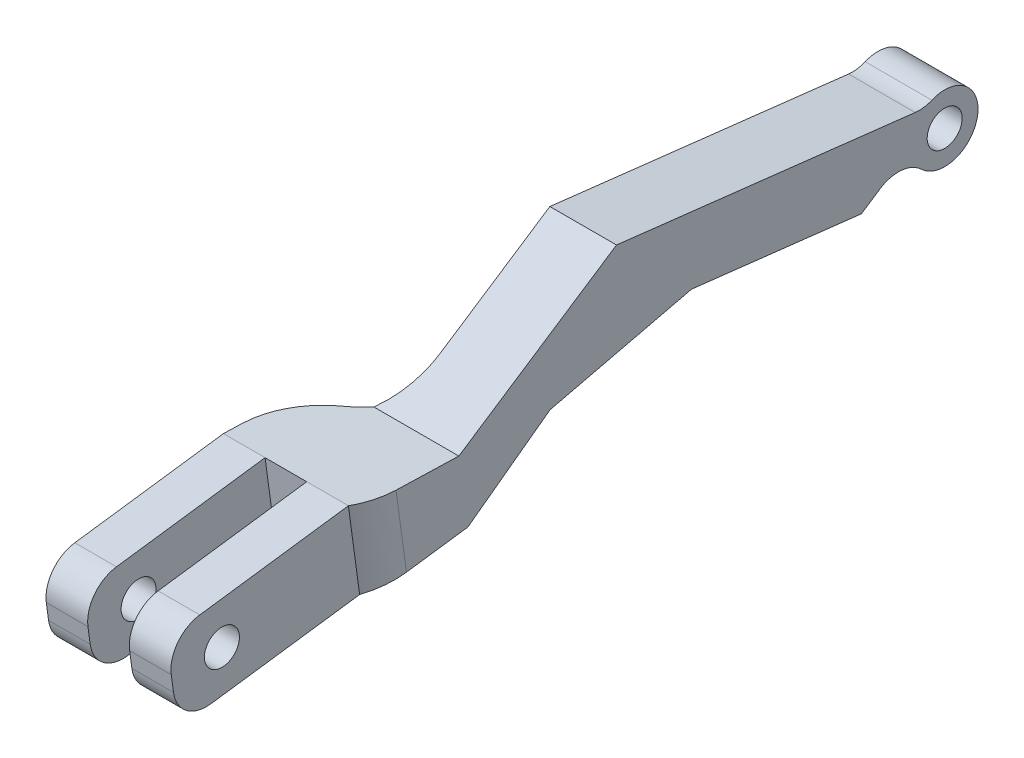
ISO-10303-21;
HEADER;
FILE_DESCRIPTION(('STEP AP214'),'2;1');
FILE_NAME('part.step','',(''),(''),'','','');
FILE_SCHEMA(('AUTOMOTIVE_DESIGN { 1 0 10303 214 1 1 1 1 }'));
ENDSEC;
DATA;
#1=APPLICATION_CONTEXT('core data for automotive mechanical design processes');
#2=APPLICATION_PROTOCOL_DEFINITION('international standard','automotive_design',2000,#1);
#3=PRODUCT_CONTEXT('',#1,'mechanical');
#4=PRODUCT('Part','Part','',(#3));
#5=PRODUCT_RELATED_PRODUCT_CATEGORY('part','',(#4));
#6=PRODUCT_DEFINITION_FORMATION('','',#4);
#7=PRODUCT_DEFINITION_CONTEXT('part definition',#1,'design');
#8=PRODUCT_DEFINITION('design','',#6,#7);
#9=PRODUCT_DEFINITION_SHAPE('','',#8);
#10=(LENGTH_UNIT() NAMED_UNIT(*) SI_UNIT(.MILLI.,.METRE.));
#11=(NAMED_UNIT(*) PLANE_ANGLE_UNIT() SI_UNIT($,.RADIAN.));
#12=(NAMED_UNIT(*) SI_UNIT($,.STERADIAN.) SOLID_ANGLE_UNIT());
#13=UNCERTAINTY_MEASURE_WITH_UNIT(LENGTH_MEASURE(1.E-05),#10,'distance_accuracy_value','');
#14=(GEOMETRIC_REPRESENTATION_CONTEXT(3) GLOBAL_UNCERTAINTY_ASSIGNED_CONTEXT((#13)) GLOBAL_UNIT_ASSIGNED_CONTEXT((#10,
#11,#12)) REPRESENTATION_CONTEXT('',''));
#15=CARTESIAN_POINT('',(0.,0.,0.));
#16=DIRECTION('',(0.,0.,1.));
#17=DIRECTION('',(1.,0.,0.));
#18=AXIS2_PLACEMENT_3D('',#15,#16,#17);
#19=CARTESIAN_POINT('',(-2.,0.,0.));
#20=DIRECTION('',(1.,0.,0.));
#21=DIRECTION('',(0.,0.,-1.));
#22=AXIS2_PLACEMENT_3D('',#19,#20,#21);
#23=PLANE('',#22);
#24=CARTESIAN_POINT('',(-2.,-2.82842712474619,-2.82842712474619));
#25=DIRECTION('',(1.,0.,0.));
#26=DIRECTION('',(0.,0.,-1.));
#27=AXIS2_PLACEMENT_3D('',#24,#25,#26);
#28=CIRCLE('',#27,1.05);
#29=CARTESIAN_POINT('',(-2.,-2.82842712474619,-3.87842712474619));
#30=VERTEX_POINT('',#29);
#31=EDGE_CURVE('E340',#30,#30,#28,.T.);
#32=ORIENTED_EDGE('',*,*,#31,.T.);
#33=EDGE_LOOP('',(#32));
#34=FACE_BOUND('',#33,.T.);
#35=DIRECTION('',(0.,0.115063520544877,0.993358135940819));
#36=VECTOR('',#35,1.);
#37=CARTESIAN_POINT('',(-2.,-4.96098461046348,0.574645069079989));
#38=LINE('',#37,#36);
#39=CARTESIAN_POINT('',(-2.,-4.77600788476289,2.17157287525382));
#40=VERTEX_POINT('',#39);
#41=CARTESIAN_POINT('',(-2.,-3.59576628097659,12.3607500701208));
#42=VERTEX_POINT('',#41);
#43=EDGE_CURVE('E330',#40,#42,#38,.T.);
#44=ORIENTED_EDGE('',*,*,#43,.T.);
#45=DIRECTION('',(0.,0.231624150850534,-0.972805351929547));
#46=VECTOR('',#45,1.);
#47=CARTESIAN_POINT('',(-2.,-0.617665679203454,-0.147065688085749));
#48=LINE('',#47,#46);
#49=CARTESIAN_POINT('',(-2.,-5.61916698864485,20.8588925578094));
#50=VERTEX_POINT('',#49);
#51=EDGE_CURVE('E11',#42,#50,#48,.F.);
#52=ORIENTED_EDGE('',*,*,#51,.T.);
#53=DIRECTION('',(0.,-0.592706629550145,0.805418432423363));
#54=VECTOR('',#53,1.);
#55=CARTESIAN_POINT('',(-2.,6.31240513743532,4.64529271090441));
#56=LINE('',#55,#54);
#57=CARTESIAN_POINT('',(-2.,-7.13671155298658,22.9210567098662));
#58=VERTEX_POINT('',#57);
#59=EDGE_CURVE('E328',#50,#58,#56,.T.);
#60=ORIENTED_EDGE('',*,*,#59,.T.);
#61=DIRECTION('',(0.,0.990856207200545,0.134922113280778));
#62=VECTOR('',#61,1.);
#63=CARTESIAN_POINT('',(-2.,-3.19419623623064,23.457897973324));
#64=LINE('',#63,#62);
#65=CARTESIAN_POINT('',(-2.,-3.37526762568091,23.4332419895982));
#66=VERTEX_POINT('',#65);
#67=EDGE_CURVE('E382',#58,#66,#64,.T.);
#68=ORIENTED_EDGE('',*,*,#67,.T.);
#69=DIRECTION('',(0.,-0.550374531244968,0.834917885397649));
#70=VECTOR('',#69,1.);
#71=CARTESIAN_POINT('',(-2.,8.41512757073982,5.54721844281332));
#72=LINE('',#71,#70);
#73=CARTESIAN_POINT('',(-2.,0.952983865511063,16.8672866676453));
#74=VERTEX_POINT('',#73);
#75=EDGE_CURVE('E325',#74,#66,#72,.T.);
#76=ORIENTED_EDGE('',*,*,#75,.F.);
#77=DIRECTION('',(0.,0.115063520544877,0.993358135940819));
#78=VECTOR('',#77,1.);
#79=CARTESIAN_POINT('',(-2.,-0.987552066700198,0.114390986900482));
#80=LINE('',#79,#78);
#81=CARTESIAN_POINT('',(-2.,-1.12340755019662,-1.0584668328871));
#82=VERTEX_POINT('',#81);
#83=EDGE_CURVE('E322',#82,#74,#80,.T.);
#84=ORIENTED_EDGE('',*,*,#83,.F.);
#85=CARTESIAN_POINT('',(-2.,0.863308721685016,-1.28859387397686));
#86=DIRECTION('',(1.,0.,0.));
#87=DIRECTION('',(0.,0.,-1.));
#88=AXIS2_PLACEMENT_3D('',#85,#86,#87);
#89=CIRCLE('',#88,2.);
#90=CARTESIAN_POINT('',(-2.,-0.982559201530589,-2.05851049936152));
#91=VERTEX_POINT('',#90);
#92=EDGE_CURVE('E320',#82,#91,#89,.T.);
#93=ORIENTED_EDGE('',*,*,#92,.T.);
#94=CARTESIAN_POINT('',(-2.,-2.82842712474619,-2.82842712474619));
#95=DIRECTION('',(1.,0.,0.));
#96=DIRECTION('',(0.,0.,-1.));
#97=AXIS2_PLACEMENT_3D('',#94,#95,#96);
#98=CIRCLE('',#97,2.);
#99=CARTESIAN_POINT('',(-2.,-4.26750807201749,-1.43952611056239));
#100=VERTEX_POINT('',#99);
#101=EDGE_CURVE('E337',#100,#91,#98,.T.);
#102=ORIENTED_EDGE('',*,*,#101,.F.);
#103=CARTESIAN_POINT('',(-2.,-5.70658901928878,-0.0506250963786051));
#104=DIRECTION('',(1.,0.,0.));
#105=DIRECTION('',(0.,0.,-1.));
#106=AXIS2_PLACEMENT_3D('',#103,#104,#105);
#107=CIRCLE('',#106,2.);
#108=CARTESIAN_POINT('',(-2.,-4.03675324849347,1.05012396611132));
#109=VERTEX_POINT('',#108);
#110=EDGE_CURVE('E335',#100,#109,#107,.T.);
#111=ORIENTED_EDGE('',*,*,#110,.T.);
#112=DIRECTION('',(0.,0.550374531244961,-0.834917885397653));
#113=VECTOR('',#112,1.);
#114=CARTESIAN_POINT('',(-2.,-2.33142136393589,-1.53686363982916));
#115=LINE('',#114,#113);
#116=EDGE_CURVE('E332',#40,#109,#115,.T.);
#117=ORIENTED_EDGE('',*,*,#116,.F.);
#118=EDGE_LOOP('',(#44,#52,#60,#68,#76,#84,#93,#102,#111,#117));
#119=FACE_BOUND('',#118,.T.);
#120=ADVANCED_FACE('F41',(#34,#119),#23,.F.);
#121=CARTESIAN_POINT('',(-2.,-4.42581069337535,32.5027668985546));
#122=DIRECTION('',(0.,-0.134922113280778,0.990856207200545));
#123=DIRECTION('',(0.,-0.990856207200545,-0.134922113280778));
#124=AXIS2_PLACEMENT_3D('',#121,#122,#123);
#125=PLANE('',#124);
#126=DIRECTION('',(1.,0.,0.));
#127=VECTOR('',#126,1.);
#128=CARTESIAN_POINT('',(-2.,-10.0580176495996,31.7358450591937));
#129=LINE('',#128,#127);
#130=CARTESIAN_POINT('',(-3.55,-10.0580176495996,31.7358450591936));
#131=VERTEX_POINT('',#130);
#132=CARTESIAN_POINT('',(-1.05,-10.0580176495996,31.7358450591936));
#133=VERTEX_POINT('',#132);
#134=EDGE_CURVE('E356',#131,#133,#129,.T.);
#135=ORIENTED_EDGE('',*,*,#134,.T.);
#136=DIRECTION('',(0.,0.990856207200545,0.134922113280778));
#137=VECTOR('',#136,1.);
#138=CARTESIAN_POINT('',(-1.05,-4.42581069337535,32.5027668985546));
#139=LINE('',#138,#137);
#140=CARTESIAN_POINT('',(-1.05,-5.10373661359683,32.4104556255975));
#141=VERTEX_POINT('',#140);
#142=EDGE_CURVE('E284',#133,#141,#139,.T.);
#143=ORIENTED_EDGE('',*,*,#142,.T.);
#144=DIRECTION('',(1.,0.,0.));
#145=VECTOR('',#144,1.);
#146=CARTESIAN_POINT('',(-2.,-5.10373661359683,32.4104556255975));
#147=LINE('',#146,#145);
#148=CARTESIAN_POINT('',(-3.55,-5.10373661359683,32.4104556255975));
#149=VERTEX_POINT('',#148);
#150=EDGE_CURVE('E359',#149,#141,#147,.T.);
#151=ORIENTED_EDGE('',*,*,#150,.F.);
#152=DIRECTION('',(0.,-0.990856207200545,-0.134922113280778));
#153=VECTOR('',#152,1.);
#154=CARTESIAN_POINT('',(-3.55,-4.42581069337535,32.5027668985546));
#155=LINE('',#154,#153);
#156=EDGE_CURVE('E225',#149,#131,#155,.T.);
#157=ORIENTED_EDGE('',*,*,#156,.T.);
#158=EDGE_LOOP('',(#135,#143,#151,#157));
#159=FACE_BOUND('',#158,.T.);
#160=ADVANCED_FACE('F487',(#159),#125,.T.);
#161=CARTESIAN_POINT('',(-2.,0.863308721685016,-1.28859387397686));
#162=DIRECTION('',(1.,0.,0.));
#163=DIRECTION('',(0.,0.,-1.));
#164=AXIS2_PLACEMENT_3D('',#161,#162,#163);
#165=CYLINDRICAL_SURFACE('',#164,2.);
#166=DIRECTION('',(1.,0.,0.));
#167=VECTOR('',#166,1.);
#168=CARTESIAN_POINT('',(-2.,-1.12340755019662,-1.0584668328871));
#169=LINE('',#168,#167);
#170=CARTESIAN_POINT('',(2.,-1.12340755019662,-1.0584668328871));
#171=VERTEX_POINT('',#170);
#172=EDGE_CURVE('E343',#82,#171,#169,.T.);
#173=ORIENTED_EDGE('',*,*,#172,.T.);
#174=CARTESIAN_POINT('',(2.,0.863308721685016,-1.28859387397686));
#175=DIRECTION('',(1.,0.,0.));
#176=DIRECTION('',(0.,0.,-1.));
#177=AXIS2_PLACEMENT_3D('',#174,#175,#176);
#178=CIRCLE('',#177,2.);
#179=CARTESIAN_POINT('',(2.,-0.982559201530589,-2.05851049936152));
#180=VERTEX_POINT('',#179);
#181=EDGE_CURVE('E290',#171,#180,#178,.T.);
#182=ORIENTED_EDGE('',*,*,#181,.T.);
#183=DIRECTION('',(1.,0.,0.));
#184=VECTOR('',#183,1.);
#185=CARTESIAN_POINT('',(-2.,-0.982559201530589,-2.05851049936152));
#186=LINE('',#185,#184);
#187=EDGE_CURVE('E344',#91,#180,#186,.T.);
#188=ORIENTED_EDGE('',*,*,#187,.F.);
#189=ORIENTED_EDGE('',*,*,#92,.F.);
#190=EDGE_LOOP('',(#173,#182,#188,#189));
#191=FACE_BOUND('',#190,.T.);
#192=ADVANCED_FACE('F466',(#191),#165,.F.);
#193=CARTESIAN_POINT('',(-2.,-2.82842712474619,-2.82842712474619));
#194=DIRECTION('',(1.,0.,0.));
#195=DIRECTION('',(0.,0.,-1.));
#196=AXIS2_PLACEMENT_3D('',#193,#194,#195);
#197=CYLINDRICAL_SURFACE('',#196,2.);
#198=ORIENTED_EDGE('',*,*,#187,.T.);
#199=CARTESIAN_POINT('',(2.,-2.82842712474619,-2.82842712474619));
#200=DIRECTION('',(1.,0.,0.));
#201=DIRECTION('',(0.,0.,-1.));
#202=AXIS2_PLACEMENT_3D('',#199,#200,#201);
#203=CIRCLE('',#202,2.);
#204=CARTESIAN_POINT('',(2.,-4.26750807201749,-1.43952611056239));
#205=VERTEX_POINT('',#204);
#206=EDGE_CURVE('E314',#205,#180,#203,.T.);
#207=ORIENTED_EDGE('',*,*,#206,.F.);
#208=DIRECTION('',(1.,0.,0.));
#209=VECTOR('',#208,1.);
#210=CARTESIAN_POINT('',(-2.,-4.26750807201749,-1.43952611056239));
#211=LINE('',#210,#209);
#212=EDGE_CURVE('E347',#100,#205,#211,.T.);
#213=ORIENTED_EDGE('',*,*,#212,.F.);
#214=ORIENTED_EDGE('',*,*,#101,.T.);
#215=EDGE_LOOP('',(#198,#207,#213,#214));
#216=FACE_BOUND('',#215,.T.);
#217=ADVANCED_FACE('F473',(#216),#197,.T.);
#218=CARTESIAN_POINT('',(-2.,-5.70658901928878,-0.0506250963786051));
#219=DIRECTION('',(1.,0.,0.));
#220=DIRECTION('',(0.,0.,-1.));
#221=AXIS2_PLACEMENT_3D('',#218,#219,#220);
#222=CYLINDRICAL_SURFACE('',#221,2.);
#223=ORIENTED_EDGE('',*,*,#212,.T.);
#224=CARTESIAN_POINT('',(2.,-5.70658901928878,-0.0506250963786051));
#225=DIRECTION('',(1.,0.,0.));
#226=DIRECTION('',(0.,0.,-1.));
#227=AXIS2_PLACEMENT_3D('',#224,#225,#226);
#228=CIRCLE('',#227,2.);
#229=CARTESIAN_POINT('',(2.,-4.03675324849347,1.05012396611132));
#230=VERTEX_POINT('',#229);
#231=EDGE_CURVE('E311',#205,#230,#228,.T.);
#232=ORIENTED_EDGE('',*,*,#231,.T.);
#233=DIRECTION('',(1.,0.,0.));
#234=VECTOR('',#233,1.);
#235=CARTESIAN_POINT('',(-2.,-4.03675324849347,1.05012396611132));
#236=LINE('',#235,#234);
#237=EDGE_CURVE('E349',#109,#230,#236,.T.);
#238=ORIENTED_EDGE('',*,*,#237,.F.);
#239=ORIENTED_EDGE('',*,*,#110,.F.);
#240=EDGE_LOOP('',(#223,#232,#238,#239));
#241=FACE_BOUND('',#240,.T.);
#242=ADVANCED_FACE('F475',(#241),#222,.F.);
#243=CARTESIAN_POINT('',(-2.,-2.33142136393589,-1.53686363982916));
#244=DIRECTION('',(0.,-0.834917885397653,-0.550374531244961));
#245=DIRECTION('',(0.,0.550374531244961,-0.834917885397653));
#246=AXIS2_PLACEMENT_3D('',#243,#244,#245);
#247=PLANE('',#246);
#248=ORIENTED_EDGE('',*,*,#237,.T.);
#249=DIRECTION('',(0.,0.550374531244961,-0.834917885397653));
#250=VECTOR('',#249,1.);
#251=CARTESIAN_POINT('',(2.,-2.33142136393589,-1.53686363982916));
#252=LINE('',#251,#250);
#253=CARTESIAN_POINT('',(2.,-4.77600788476289,2.17157287525382));
#254=VERTEX_POINT('',#253);
#255=EDGE_CURVE('E308',#254,#230,#252,.T.);
#256=ORIENTED_EDGE('',*,*,#255,.F.);
#257=DIRECTION('',(1.,0.,0.));
#258=VECTOR('',#257,1.);
#259=CARTESIAN_POINT('',(-2.,-4.77600788476289,2.17157287525382));
#260=LINE('',#259,#258);
#261=EDGE_CURVE('E351',#40,#254,#260,.T.);
#262=ORIENTED_EDGE('',*,*,#261,.F.);
#263=ORIENTED_EDGE('',*,*,#116,.T.);
#264=EDGE_LOOP('',(#248,#256,#262,#263));
#265=FACE_BOUND('',#264,.T.);
#266=ADVANCED_FACE('F478',(#265),#247,.T.);
#267=CARTESIAN_POINT('',(-2.,-4.96098461046348,0.574645069079989));
#268=DIRECTION('',(0.,0.993358135940819,-0.115063520544877));
#269=DIRECTION('',(0.,0.115063520544877,0.993358135940819));
#270=AXIS2_PLACEMENT_3D('',#267,#268,#269);
#271=PLANE('',#270);
#272=DIRECTION('',(0.,0.115063520544877,0.993358135940819));
#273=VECTOR('',#272,1.);
#274=CARTESIAN_POINT('',(2.,-4.96098461046348,0.574645069079989));
#275=LINE('',#274,#273);
#276=CARTESIAN_POINT('',(2.,-3.59576628097659,12.3607500701208));
#277=VERTEX_POINT('',#276);
#278=EDGE_CURVE('E306',#254,#277,#275,.T.);
#279=ORIENTED_EDGE('',*,*,#278,.T.);
#280=DIRECTION('',(-1.,0.,0.));
#281=VECTOR('',#280,1.);
#282=CARTESIAN_POINT('',(-2.,-3.59576628097659,12.3607500701208));
#283=LINE('',#282,#281);
#284=EDGE_CURVE('E57',#277,#42,#283,.T.);
#285=ORIENTED_EDGE('',*,*,#284,.T.);
#286=ORIENTED_EDGE('',*,*,#43,.F.);
#287=ORIENTED_EDGE('',*,*,#261,.T.);
#288=EDGE_LOOP('',(#279,#285,#286,#287));
#289=FACE_BOUND('',#288,.T.);
#290=ADVANCED_FACE('F508',(#289),#271,.F.);
#291=CARTESIAN_POINT('',(-2.,6.31240513743532,4.64529271090441));
#292=DIRECTION('',(0.,0.805418432423363,0.592706629550145));
#293=DIRECTION('',(0.,-0.592706629550145,0.805418432423363));
#294=AXIS2_PLACEMENT_3D('',#291,#292,#293);
#295=PLANE('',#294);
#296=ORIENTED_EDGE('',*,*,#59,.F.);
#297=DIRECTION('',(1.,0.,0.));
#298=VECTOR('',#297,1.);
#299=CARTESIAN_POINT('',(2.,-5.61916698864485,20.8588925578094));
#300=LINE('',#299,#298);
#301=CARTESIAN_POINT('',(2.,-5.61916698864485,20.8588925578094));
#302=VERTEX_POINT('',#301);
#303=EDGE_CURVE('E429',#50,#302,#300,.T.);
#304=ORIENTED_EDGE('',*,*,#303,.T.);
#305=DIRECTION('',(0.,-0.592706629550145,0.805418432423363));
#306=VECTOR('',#305,1.);
#307=CARTESIAN_POINT('',(2.,6.31240513743532,4.64529271090441));
#308=LINE('',#307,#306);
#309=CARTESIAN_POINT('',(2.,-9.24848496991489,25.7907078159904));
#310=VERTEX_POINT('',#309);
#311=EDGE_CURVE('E304',#302,#310,#308,.T.);
#312=ORIENTED_EDGE('',*,*,#311,.T.);
#313=DIRECTION('',(1.,0.,0.));
#314=VECTOR('',#313,1.);
#315=CARTESIAN_POINT('',(-2.,-9.24848496991489,25.7907078159904));
#316=LINE('',#315,#314);
#317=CARTESIAN_POINT('',(-3.09954996537938,-9.24848496991489,25.7907078159904));
#318=VERTEX_POINT('',#317);
#319=EDGE_CURVE('E353',#318,#310,#316,.T.);
#320=ORIENTED_EDGE('',*,*,#319,.F.);
#321=CARTESIAN_POINT('',(-7.,-7.13671155298658,22.9210567098662));
#322=DIRECTION('',(0.,0.805418432423363,0.592706629550145));
#323=DIRECTION('',(0.,0.592706629550145,-0.805418432423363));
#324=AXIS2_PLACEMENT_3D('',#321,#322,#323);
#325=ELLIPSE('',#324,5.69461109863516,5.);
#326=EDGE_CURVE('E387',#318,#58,#325,.T.);
#327=ORIENTED_EDGE('',*,*,#326,.T.);
#328=EDGE_LOOP('',(#296,#304,#312,#320,#327));
#329=FACE_BOUND('',#328,.T.);
#330=ADVANCED_FACE('F435',(#329),#295,.F.);
#331=CARTESIAN_POINT('',(-2.,-5.6322069562242,-0.766921839360963));
#332=DIRECTION('',(0.,0.990856207200545,0.134922113280778));
#333=DIRECTION('',(0.,-0.134922113280778,0.990856207200545));
#334=AXIS2_PLACEMENT_3D('',#331,#332,#333);
#335=PLANE('',#334);
#336=DIRECTION('',(0.,-0.134922113280778,0.990856207200545));
#337=VECTOR('',#336,1.);
#338=CARTESIAN_POINT('',(-3.55,-5.6322069562242,-0.766921839360963));
#339=LINE('',#338,#337);
#340=CARTESIAN_POINT('',(-3.55,-11.2723166691266,40.6535509239985));
#341=VERTEX_POINT('',#340);
#342=EDGE_CURVE('E248',#131,#341,#339,.T.);
#343=ORIENTED_EDGE('',*,*,#342,.T.);
#344=DIRECTION('',(1.,0.,0.));
#345=VECTOR('',#344,1.);
#346=CARTESIAN_POINT('',(-6.05,-11.2723166691266,40.6535509239985));
#347=LINE('',#346,#345);
#348=CARTESIAN_POINT('',(-6.05,-11.2723166691266,40.6535509239985));
#349=VERTEX_POINT('',#348);
#350=EDGE_CURVE('E407',#341,#349,#347,.F.);
#351=ORIENTED_EDGE('',*,*,#350,.T.);
#352=DIRECTION('',(0.,-0.134922113280778,0.990856207200545));
#353=VECTOR('',#352,1.);
#354=CARTESIAN_POINT('',(-6.05,-5.6322069562242,-0.766921839360963));
#355=LINE('',#354,#353);
#356=CARTESIAN_POINT('',(-6.05,-9.91080689117011,30.6547421160981));
#357=VERTEX_POINT('',#356);
#358=EDGE_CURVE('E244',#357,#349,#355,.T.);
#359=ORIENTED_EDGE('',*,*,#358,.F.);
#360=CARTESIAN_POINT('',(-1.05,-9.91080689117011,30.6547421160981));
#361=DIRECTION('',(0.,0.990856207200545,0.134922113280778));
#362=DIRECTION('',(0.,-0.134922113280778,0.990856207200545));
#363=AXIS2_PLACEMENT_3D('',#360,#361,#362);
#364=CIRCLE('',#363,5.);
#365=CARTESIAN_POINT('',(-4.025,-9.36860504181248,26.6728591250306));
#366=VERTEX_POINT('',#365);
#367=EDGE_CURVE('E375',#357,#366,#364,.F.);
#368=ORIENTED_EDGE('',*,*,#367,.T.);
#369=CARTESIAN_POINT('',(-7.,-8.82640319245485,22.690976133963));
#370=DIRECTION('',(0.,0.990856207200545,0.134922113280778));
#371=DIRECTION('',(0.,-0.134922113280778,0.990856207200545));
#372=AXIS2_PLACEMENT_3D('',#369,#370,#371);
#373=CIRCLE('',#372,5.);
#374=EDGE_CURVE('E384',#366,#318,#373,.T.);
#375=ORIENTED_EDGE('',*,*,#374,.T.);
#376=ORIENTED_EDGE('',*,*,#319,.T.);
#377=DIRECTION('',(0.,-0.134922113280778,0.990856207200545));
#378=VECTOR('',#377,1.);
#379=CARTESIAN_POINT('',(2.,-5.6322069562242,-0.766921839360963));
#380=LINE('',#379,#378);
#381=CARTESIAN_POINT('',(2.,-9.75042186183653,29.4768884789667));
#382=VERTEX_POINT('',#381);
#383=EDGE_CURVE('E301',#310,#382,#380,.T.);
#384=ORIENTED_EDGE('',*,*,#383,.T.);
#385=CARTESIAN_POINT('',(-3.,-9.75042186183653,29.4768884789667));
#386=DIRECTION('',(0.,0.990856207200545,0.134922113280778));
#387=DIRECTION('',(0.,-0.134922113280778,0.990856207200545));
#388=AXIS2_PLACEMENT_3D('',#385,#386,#387);
#389=CIRCLE('',#388,5.);
#390=CARTESIAN_POINT('',(1.45,-10.0580176495996,31.7358450591936));
#391=VERTEX_POINT('',#390);
#392=EDGE_CURVE('E369',#382,#391,#389,.F.);
#393=ORIENTED_EDGE('',*,*,#392,.T.);
#394=DIRECTION('',(0.,-0.134922113280778,0.990856207200545));
#395=VECTOR('',#394,1.);
#396=CARTESIAN_POINT('',(1.45,-5.6322069562242,-0.766921839360963));
#397=LINE('',#396,#395);
#398=CARTESIAN_POINT('',(1.45,-11.2723166691266,40.6535509239985));
#399=VERTEX_POINT('',#398);
#400=EDGE_CURVE('E259',#391,#399,#397,.T.);
#401=ORIENTED_EDGE('',*,*,#400,.T.);
#402=DIRECTION('',(-1.,0.,0.));
#403=VECTOR('',#402,1.);
#404=CARTESIAN_POINT('',(-2.,-11.2723166691266,40.6535509239985));
#405=LINE('',#404,#403);
#406=CARTESIAN_POINT('',(-1.05,-11.2723166691266,40.6535509239985));
#407=VERTEX_POINT('',#406);
#408=EDGE_CURVE('E404',#399,#407,#405,.T.);
#409=ORIENTED_EDGE('',*,*,#408,.T.);
#410=DIRECTION('',(0.,-0.134922113280778,0.990856207200545));
#411=VECTOR('',#410,1.);
#412=CARTESIAN_POINT('',(-1.05,-5.6322069562242,-0.766921839360963));
#413=LINE('',#412,#411);
#414=EDGE_CURVE('E258',#133,#407,#413,.T.);
#415=ORIENTED_EDGE('',*,*,#414,.F.);
#416=ORIENTED_EDGE('',*,*,#134,.F.);
#417=EDGE_LOOP('',(#343,#351,#359,#368,#375,#376,#384,#393,#401,#409,#415,#416));
#418=FACE_BOUND('',#417,.T.);
#419=ADVANCED_FACE('F444',(#418),#335,.F.);
#420=CARTESIAN_POINT('',(-2.,-6.06490845541673,0.180871687383158));
#421=DIRECTION('',(0.,-0.99955560096244,0.0298094042982452));
#422=DIRECTION('',(0.,-0.0298094042982452,-0.99955560096244));
#423=AXIS2_PLACEMENT_3D('',#420,#421,#422);
#424=PLANE('',#423);
#425=DIRECTION('',(1.,0.,0.));
#426=VECTOR('',#425,1.);
#427=CARTESIAN_POINT('',(-2.,-5.28506014111271,26.3303962691135));
#428=LINE('',#427,#426);
#429=CARTESIAN_POINT('',(-3.09954996537938,-5.28506014111271,26.3303962691135));
#430=VERTEX_POINT('',#429);
#431=CARTESIAN_POINT('',(2.,-5.28506014111271,26.3303962691135));
#432=VERTEX_POINT('',#431);
#433=EDGE_CURVE('E361',#430,#432,#428,.T.);
#434=ORIENTED_EDGE('',*,*,#433,.F.);
#435=CARTESIAN_POINT('',(-7.,-5.37960031065724,23.1603176241761));
#436=DIRECTION('',(0.,-0.99955560096244,0.0298094042982452));
#437=DIRECTION('',(0.,0.0298094042982452,0.99955560096244));
#438=AXIS2_PLACEMENT_3D('',#435,#436,#437);
#439=ELLIPSE('',#438,5.06896877524852,5.);
#440=CARTESIAN_POINT('',(-4.025,-5.25815499483694,27.2325675901366));
#441=VERTEX_POINT('',#440);
#442=EDGE_CURVE('E393',#430,#441,#439,.T.);
#443=ORIENTED_EDGE('',*,*,#442,.T.);
#444=CARTESIAN_POINT('',(-1.05,-5.13670967901664,31.3048175560971));
#445=DIRECTION('',(0.,-0.99955560096244,0.0298094042982452));
#446=DIRECTION('',(0.,0.0298094042982452,0.99955560096244));
#447=AXIS2_PLACEMENT_3D('',#444,#445,#446);
#448=ELLIPSE('',#447,5.06896877524852,5.);
#449=CARTESIAN_POINT('',(-6.05,-5.13670967901664,31.3048175560971));
#450=VERTEX_POINT('',#449);
#451=EDGE_CURVE('E231',#441,#450,#448,.F.);
#452=ORIENTED_EDGE('',*,*,#451,.T.);
#453=DIRECTION('',(0.,-0.0298094042982452,-0.99955560096244));
#454=VECTOR('',#453,1.);
#455=CARTESIAN_POINT('',(-6.05,-6.06490845541673,0.180871687383158));
#456=LINE('',#455,#454);
#457=CARTESIAN_POINT('',(-6.05,-5.10373661359683,32.4104556255975));
#458=VERTEX_POINT('',#457);
#459=EDGE_CURVE('E226',#458,#450,#456,.T.);
#460=ORIENTED_EDGE('',*,*,#459,.F.);
#461=DIRECTION('',(1.,0.,0.));
#462=VECTOR('',#461,1.);
#463=CARTESIAN_POINT('',(-6.05,-5.10373661359683,32.4104556255975));
#464=LINE('',#463,#462);
#465=EDGE_CURVE('E213',#458,#149,#464,.T.);
#466=ORIENTED_EDGE('',*,*,#465,.T.);
#467=ORIENTED_EDGE('',*,*,#150,.T.);
#468=DIRECTION('',(-1.,0.,0.));
#469=VECTOR('',#468,1.);
#470=CARTESIAN_POINT('',(1.45,-5.10373661359683,32.4104556255975));
#471=LINE('',#470,#469);
#472=CARTESIAN_POINT('',(1.45,-5.10373661359683,32.4104556255975));
#473=VERTEX_POINT('',#472);
#474=EDGE_CURVE('E272',#473,#141,#471,.T.);
#475=ORIENTED_EDGE('',*,*,#474,.F.);
#476=CARTESIAN_POINT('',(-3.,-5.17263358920496,30.1002330807435));
#477=DIRECTION('',(0.,-0.99955560096244,0.0298094042982452));
#478=DIRECTION('',(0.,0.0298094042982452,0.99955560096244));
#479=AXIS2_PLACEMENT_3D('',#476,#477,#478);
#480=ELLIPSE('',#479,5.06896877524852,5.);
#481=CARTESIAN_POINT('',(2.,-5.17263358920496,30.1002330807435));
#482=VERTEX_POINT('',#481);
#483=EDGE_CURVE('E371',#473,#482,#480,.F.);
#484=ORIENTED_EDGE('',*,*,#483,.T.);
#485=DIRECTION('',(0.,-0.0298094042982452,-0.99955560096244));
#486=VECTOR('',#485,1.);
#487=CARTESIAN_POINT('',(2.,-6.06490845541673,0.180871687383158));
#488=LINE('',#487,#486);
#489=EDGE_CURVE('E299',#482,#432,#488,.T.);
#490=ORIENTED_EDGE('',*,*,#489,.T.);
#491=EDGE_LOOP('',(#434,#443,#452,#460,#466,#467,#475,#484,#490));
#492=FACE_BOUND('',#491,.T.);
#493=ADVANCED_FACE('F229',(#492),#424,.F.);
#494=CARTESIAN_POINT('',(-2.,8.41512757073982,5.54721844281332));
#495=DIRECTION('',(0.,0.834917885397649,0.550374531244968));
#496=DIRECTION('',(0.,-0.550374531244968,0.834917885397649));
#497=AXIS2_PLACEMENT_3D('',#494,#495,#496);
#498=PLANE('',#497);
#499=ORIENTED_EDGE('',*,*,#433,.T.);
#500=DIRECTION('',(0.,-0.550374531244968,0.834917885397649));
#501=VECTOR('',#500,1.);
#502=CARTESIAN_POINT('',(2.,8.41512757073982,5.54721844281332));
#503=LINE('',#502,#501);
#504=CARTESIAN_POINT('',(2.,0.952983865511063,16.8672866676453));
#505=VERTEX_POINT('',#504);
#506=EDGE_CURVE('E296',#505,#432,#503,.T.);
#507=ORIENTED_EDGE('',*,*,#506,.F.);
#508=DIRECTION('',(1.,0.,0.));
#509=VECTOR('',#508,1.);
#510=CARTESIAN_POINT('',(-2.,0.952983865511063,16.8672866676453));
#511=LINE('',#510,#509);
#512=EDGE_CURVE('E364',#74,#505,#511,.T.);
#513=ORIENTED_EDGE('',*,*,#512,.F.);
#514=ORIENTED_EDGE('',*,*,#75,.T.);
#515=CARTESIAN_POINT('',(-7.,-3.3752676256809,23.4332419895982));
#516=DIRECTION('',(0.,0.834917885397649,0.550374531244968));
#517=DIRECTION('',(0.,0.550374531244968,-0.834917885397649));
#518=AXIS2_PLACEMENT_3D('',#515,#516,#517);
#519=ELLIPSE('',#518,5.54605784460533,5.);
#520=EDGE_CURVE('E390',#66,#430,#519,.F.);
#521=ORIENTED_EDGE('',*,*,#520,.T.);
#522=EDGE_LOOP('',(#499,#507,#513,#514,#521));
#523=FACE_BOUND('',#522,.T.);
#524=ADVANCED_FACE('F456',(#523),#498,.T.);
#525=CARTESIAN_POINT('',(-2.,-0.987552066700198,0.114390986900482));
#526=DIRECTION('',(0.,0.993358135940819,-0.115063520544877));
#527=DIRECTION('',(0.,0.115063520544877,0.993358135940819));
#528=AXIS2_PLACEMENT_3D('',#525,#526,#527);
#529=PLANE('',#528);
#530=ORIENTED_EDGE('',*,*,#512,.T.);
#531=DIRECTION('',(0.,0.115063520544877,0.993358135940819));
#532=VECTOR('',#531,1.);
#533=CARTESIAN_POINT('',(2.,-0.987552066700198,0.114390986900482));
#534=LINE('',#533,#532);
#535=EDGE_CURVE('E293',#171,#505,#534,.T.);
#536=ORIENTED_EDGE('',*,*,#535,.F.);
#537=ORIENTED_EDGE('',*,*,#172,.F.);
#538=ORIENTED_EDGE('',*,*,#83,.T.);
#539=EDGE_LOOP('',(#530,#536,#537,#538));
#540=FACE_BOUND('',#539,.T.);
#541=ADVANCED_FACE('F460',(#540),#529,.T.);
#542=CARTESIAN_POINT('',(-2.,-2.82842712474619,-2.82842712474619));
#543=DIRECTION('',(1.,0.,0.));
#544=DIRECTION('',(0.,0.,-1.));
#545=AXIS2_PLACEMENT_3D('',#542,#543,#544);
#546=CYLINDRICAL_SURFACE('',#545,1.05);
#547=ORIENTED_EDGE('',*,*,#31,.F.);
#548=EDGE_LOOP('',(#547));
#549=FACE_BOUND('',#548,.T.);
#550=CARTESIAN_POINT('',(2.,-2.82842712474619,-2.82842712474619));
#551=DIRECTION('',(1.,0.,0.));
#552=DIRECTION('',(0.,0.,-1.));
#553=AXIS2_PLACEMENT_3D('',#550,#551,#552);
#554=CIRCLE('',#553,1.05);
#555=CARTESIAN_POINT('',(2.,-2.82842712474619,-3.87842712474619));
#556=VERTEX_POINT('',#555);
#557=EDGE_CURVE('E317',#556,#556,#554,.T.);
#558=ORIENTED_EDGE('',*,*,#557,.T.);
#559=EDGE_LOOP('',(#558));
#560=FACE_BOUND('',#559,.T.);
#561=ADVANCED_FACE('F498',(#549,#560),#546,.F.);
#562=CARTESIAN_POINT('',(2.,0.,0.));
#563=DIRECTION('',(1.,0.,0.));
#564=DIRECTION('',(0.,0.,-1.));
#565=AXIS2_PLACEMENT_3D('',#562,#563,#564);
#566=PLANE('',#565);
#567=ORIENTED_EDGE('',*,*,#489,.F.);
#568=DIRECTION('',(0.,-0.990856207200545,-0.134922113280778));
#569=VECTOR('',#568,1.);
#570=CARTESIAN_POINT('',(2.,-9.75042186183653,29.4768884789667));
#571=LINE('',#570,#569);
#572=EDGE_CURVE('E346',#482,#382,#571,.T.);
#573=ORIENTED_EDGE('',*,*,#572,.T.);
#574=ORIENTED_EDGE('',*,*,#383,.F.);
#575=ORIENTED_EDGE('',*,*,#311,.F.);
#576=DIRECTION('',(0.,-0.231624150850534,0.972805351929547));
#577=VECTOR('',#576,1.);
#578=CARTESIAN_POINT('',(2.,-5.61916698864485,20.8588925578094));
#579=LINE('',#578,#577);
#580=EDGE_CURVE('E50',#302,#277,#579,.F.);
#581=ORIENTED_EDGE('',*,*,#580,.T.);
#582=ORIENTED_EDGE('',*,*,#278,.F.);
#583=ORIENTED_EDGE('',*,*,#255,.T.);
#584=ORIENTED_EDGE('',*,*,#231,.F.);
#585=ORIENTED_EDGE('',*,*,#206,.T.);
#586=ORIENTED_EDGE('',*,*,#181,.F.);
#587=ORIENTED_EDGE('',*,*,#535,.T.);
#588=ORIENTED_EDGE('',*,*,#506,.T.);
#589=EDGE_LOOP('',(#567,#573,#574,#575,#581,#582,#583,#584,#585,#586,#587,#588));
#590=FACE_BOUND('',#589,.T.);
#591=ORIENTED_EDGE('',*,*,#557,.F.);
#592=EDGE_LOOP('',(#591));
#593=FACE_BOUND('',#592,.T.);
#594=ADVANCED_FACE('F440',(#590,#593),#566,.T.);
#595=CARTESIAN_POINT('',(1.45,-0.67792592022149,-0.092311272957073));
#596=DIRECTION('',(0.,-0.990856207200545,-0.134922113280778));
#597=DIRECTION('',(0.,0.134922113280778,-0.990856207200545));
#598=AXIS2_PLACEMENT_3D('',#595,#596,#597);
#599=PLANE('',#598);
#600=DIRECTION('',(0.,-0.134922113280778,0.990856207200545));
#601=VECTOR('',#600,1.);
#602=CARTESIAN_POINT('',(-1.05,-0.67792592022149,-0.092311272957073));
#603=LINE('',#602,#601);
#604=CARTESIAN_POINT('',(-1.05,-6.31803563312384,41.3281614904024));
#605=VERTEX_POINT('',#604);
#606=EDGE_CURVE('E275',#141,#605,#603,.T.);
#607=ORIENTED_EDGE('',*,*,#606,.T.);
#608=DIRECTION('',(-1.,0.,0.));
#609=VECTOR('',#608,1.);
#610=CARTESIAN_POINT('',(1.45,-6.31803563312384,41.3281614904024));
#611=LINE('',#610,#609);
#612=CARTESIAN_POINT('',(1.45,-6.31803563312384,41.3281614904024));
#613=VERTEX_POINT('',#612);
#614=EDGE_CURVE('E425',#605,#613,#611,.F.);
#615=ORIENTED_EDGE('',*,*,#614,.T.);
#616=DIRECTION('',(0.,-0.134922113280778,0.990856207200545));
#617=VECTOR('',#616,1.);
#618=CARTESIAN_POINT('',(1.45,-0.67792592022149,-0.092311272957073));
#619=LINE('',#618,#617);
#620=EDGE_CURVE('E262',#473,#613,#619,.T.);
#621=ORIENTED_EDGE('',*,*,#620,.F.);
#622=ORIENTED_EDGE('',*,*,#474,.T.);
#623=EDGE_LOOP('',(#607,#615,#621,#622));
#624=FACE_BOUND('',#623,.T.);
#625=ADVANCED_FACE('F569',(#624),#599,.F.);
#626=CARTESIAN_POINT('',(1.45,-5.90995393946395,43.4021851777606));
#627=DIRECTION('',(0.,0.134922113280779,-0.990856207200545));
#628=DIRECTION('',(0.,0.990856207200545,0.134922113280779));
#629=AXIS2_PLACEMENT_3D('',#626,#627,#628);
#630=PLANE('',#629);
#631=DIRECTION('',(0.,-0.990856207200545,-0.134922113280779));
#632=VECTOR('',#631,1.);
#633=CARTESIAN_POINT('',(-1.05,-5.90995393946395,43.4021851777606));
#634=LINE('',#633,#632);
#635=CARTESIAN_POINT('',(-1.05,-8.56959227408648,43.040029678242));
#636=VERTEX_POINT('',#635);
#637=CARTESIAN_POINT('',(-1.05,-9.56044848128703,42.9051075649612));
#638=VERTEX_POINT('',#637);
#639=EDGE_CURVE('E278',#636,#638,#634,.T.);
#640=ORIENTED_EDGE('',*,*,#639,.T.);
#641=DIRECTION('',(-1.,0.,0.));
#642=VECTOR('',#641,1.);
#643=CARTESIAN_POINT('',(1.45,-9.56044848128703,42.9051075649612));
#644=LINE('',#643,#642);
#645=CARTESIAN_POINT('',(1.45,-9.56044848128703,42.9051075649612));
#646=VERTEX_POINT('',#645);
#647=EDGE_CURVE('E419',#638,#646,#644,.F.);
#648=ORIENTED_EDGE('',*,*,#647,.T.);
#649=DIRECTION('',(0.,-0.990856207200545,-0.134922113280779));
#650=VECTOR('',#649,1.);
#651=CARTESIAN_POINT('',(1.45,-5.90995393946395,43.4021851777606));
#652=LINE('',#651,#650);
#653=CARTESIAN_POINT('',(1.45,-8.56959227408648,43.040029678242));
#654=VERTEX_POINT('',#653);
#655=EDGE_CURVE('E266',#654,#646,#652,.T.);
#656=ORIENTED_EDGE('',*,*,#655,.F.);
#657=DIRECTION('',(-1.,0.,0.));
#658=VECTOR('',#657,1.);
#659=CARTESIAN_POINT('',(1.45,-8.56959227408648,43.040029678242));
#660=LINE('',#659,#658);
#661=EDGE_CURVE('E416',#654,#636,#660,.T.);
#662=ORIENTED_EDGE('',*,*,#661,.T.);
#663=EDGE_LOOP('',(#640,#648,#656,#662));
#664=FACE_BOUND('',#663,.T.);
#665=ADVANCED_FACE('F555',(#664),#630,.F.);
#666=CARTESIAN_POINT('',(1.45,-8.66025403784442,40.));
#667=DIRECTION('',(-1.,0.,0.));
#668=DIRECTION('',(0.,0.,1.));
#669=AXIS2_PLACEMENT_3D('',#666,#667,#668);
#670=CYLINDRICAL_SURFACE('',#669,1.05);
#671=CARTESIAN_POINT('',(1.45,-8.66025403784442,40.));
#672=DIRECTION('',(1.,0.,0.));
#673=DIRECTION('',(0.,0.,-1.));
#674=AXIS2_PLACEMENT_3D('',#671,#672,#673);
#675=CIRCLE('',#674,1.05);
#676=CARTESIAN_POINT('',(1.45,-8.66025403784442,38.95));
#677=VERTEX_POINT('',#676);
#678=EDGE_CURVE('E269',#677,#677,#675,.T.);
#679=ORIENTED_EDGE('',*,*,#678,.T.);
#680=EDGE_LOOP('',(#679));
#681=FACE_BOUND('',#680,.T.);
#682=CARTESIAN_POINT('',(-1.05,-8.66025403784442,40.));
#683=DIRECTION('',(1.,0.,0.));
#684=DIRECTION('',(0.,0.,-1.));
#685=AXIS2_PLACEMENT_3D('',#682,#683,#684);
#686=CIRCLE('',#685,1.05);
#687=CARTESIAN_POINT('',(-1.05,-8.66025403784442,38.95));
#688=VERTEX_POINT('',#687);
#689=EDGE_CURVE('E263',#688,#688,#686,.T.);
#690=ORIENTED_EDGE('',*,*,#689,.F.);
#691=EDGE_LOOP('',(#690));
#692=FACE_BOUND('',#691,.T.);
#693=ADVANCED_FACE('F575',(#681,#692),#670,.F.);
#694=CARTESIAN_POINT('',(1.45,0.,0.));
#695=DIRECTION('',(1.,0.,0.));
#696=DIRECTION('',(0.,0.,-1.));
#697=AXIS2_PLACEMENT_3D('',#694,#695,#696);
#698=PLANE('',#697);
#699=ORIENTED_EDGE('',*,*,#655,.T.);
#700=CARTESIAN_POINT('',(1.45,-9.29060425472547,40.9233951505601));
#701=DIRECTION('',(1.,0.,0.));
#702=DIRECTION('',(0.,0.,-1.));
#703=AXIS2_PLACEMENT_3D('',#700,#701,#702);
#704=CIRCLE('',#703,2.);
#705=EDGE_CURVE('E423',#646,#399,#704,.T.);
#706=ORIENTED_EDGE('',*,*,#705,.T.);
#707=ORIENTED_EDGE('',*,*,#400,.F.);
#708=DIRECTION('',(0.,0.990856207200545,0.134922113280778));
#709=VECTOR('',#708,1.);
#710=CARTESIAN_POINT('',(1.45,-4.42581069337535,32.5027668985546));
#711=LINE('',#710,#709);
#712=EDGE_CURVE('E287',#391,#473,#711,.T.);
#713=ORIENTED_EDGE('',*,*,#712,.T.);
#714=ORIENTED_EDGE('',*,*,#620,.T.);
#715=CARTESIAN_POINT('',(1.45,-8.29974804752492,41.0583172638409));
#716=DIRECTION('',(1.,0.,0.));
#717=DIRECTION('',(0.,0.,-1.));
#718=AXIS2_PLACEMENT_3D('',#715,#716,#717);
#719=CIRCLE('',#718,2.);
#720=EDGE_CURVE('E421',#613,#654,#719,.T.);
#721=ORIENTED_EDGE('',*,*,#720,.T.);
#722=EDGE_LOOP('',(#699,#706,#707,#713,#714,#721));
#723=FACE_BOUND('',#722,.T.);
#724=ORIENTED_EDGE('',*,*,#678,.F.);
#725=EDGE_LOOP('',(#724));
#726=FACE_BOUND('',#725,.T.);
#727=ADVANCED_FACE('F551',(#723,#726),#698,.T.);
#728=CARTESIAN_POINT('',(-1.05,0.,0.));
#729=DIRECTION('',(1.,0.,0.));
#730=DIRECTION('',(0.,0.,-1.));
#731=AXIS2_PLACEMENT_3D('',#728,#729,#730);
#732=PLANE('',#731);
#733=ORIENTED_EDGE('',*,*,#414,.T.);
#734=CARTESIAN_POINT('',(-1.05,-9.29060425472547,40.9233951505601));
#735=DIRECTION('',(1.,0.,0.));
#736=DIRECTION('',(0.,0.,-1.));
#737=AXIS2_PLACEMENT_3D('',#734,#735,#736);
#738=CIRCLE('',#737,2.);
#739=EDGE_CURVE('E414',#407,#638,#738,.F.);
#740=ORIENTED_EDGE('',*,*,#739,.T.);
#741=ORIENTED_EDGE('',*,*,#639,.F.);
#742=CARTESIAN_POINT('',(-1.05,-8.29974804752492,41.0583172638409));
#743=DIRECTION('',(1.,0.,0.));
#744=DIRECTION('',(0.,0.,-1.));
#745=AXIS2_PLACEMENT_3D('',#742,#743,#744);
#746=CIRCLE('',#745,2.);
#747=EDGE_CURVE('E412',#636,#605,#746,.F.);
#748=ORIENTED_EDGE('',*,*,#747,.T.);
#749=ORIENTED_EDGE('',*,*,#606,.F.);
#750=ORIENTED_EDGE('',*,*,#142,.F.);
#751=EDGE_LOOP('',(#733,#740,#741,#748,#749,#750));
#752=FACE_BOUND('',#751,.T.);
#753=ORIENTED_EDGE('',*,*,#689,.T.);
#754=EDGE_LOOP('',(#753));
#755=FACE_BOUND('',#754,.T.);
#756=ADVANCED_FACE('F563',(#752,#755),#732,.F.);
#757=CARTESIAN_POINT('',(-3.55,0.,0.));
#758=DIRECTION('',(1.,0.,0.));
#759=DIRECTION('',(0.,0.,-1.));
#760=AXIS2_PLACEMENT_3D('',#757,#758,#759);
#761=PLANE('',#760);
#762=CARTESIAN_POINT('',(-3.55,-8.66025403784442,40.));
#763=DIRECTION('',(1.,0.,0.));
#764=DIRECTION('',(0.,0.,-1.));
#765=AXIS2_PLACEMENT_3D('',#762,#763,#764);
#766=CIRCLE('',#765,1.05);
#767=CARTESIAN_POINT('',(-3.55,-8.66025403784442,38.95));
#768=VERTEX_POINT('',#767);
#769=EDGE_CURVE('E607',#768,#768,#766,.T.);
#770=ORIENTED_EDGE('',*,*,#769,.F.);
#771=EDGE_LOOP('',(#770));
#772=FACE_BOUND('',#771,.T.);
#773=DIRECTION('',(0.,-0.990856207200545,-0.134922113280779));
#774=VECTOR('',#773,1.);
#775=CARTESIAN_POINT('',(-3.55,-5.90995393946394,43.4021851777606));
#776=LINE('',#775,#774);
#777=CARTESIAN_POINT('',(-3.55,-8.56959227408648,43.040029678242));
#778=VERTEX_POINT('',#777);
#779=CARTESIAN_POINT('',(-3.55,-9.56044848128703,42.9051075649612));
#780=VERTEX_POINT('',#779);
#781=EDGE_CURVE('E251',#778,#780,#776,.T.);
#782=ORIENTED_EDGE('',*,*,#781,.T.);
#783=CARTESIAN_POINT('',(-3.55,-9.29060425472547,40.9233951505601));
#784=DIRECTION('',(1.,0.,0.));
#785=DIRECTION('',(0.,0.,-1.));
#786=AXIS2_PLACEMENT_3D('',#783,#784,#785);
#787=CIRCLE('',#786,2.);
#788=EDGE_CURVE('E402',#780,#341,#787,.T.);
#789=ORIENTED_EDGE('',*,*,#788,.T.);
#790=ORIENTED_EDGE('',*,*,#342,.F.);
#791=ORIENTED_EDGE('',*,*,#156,.F.);
#792=DIRECTION('',(0.,-0.134922113280778,0.990856207200545));
#793=VECTOR('',#792,1.);
#794=CARTESIAN_POINT('',(-3.55,-0.67792592022149,-0.092311272957073));
#795=LINE('',#794,#793);
#796=CARTESIAN_POINT('',(-3.55,-6.31803563312383,41.3281614904024));
#797=VERTEX_POINT('',#796);
#798=EDGE_CURVE('E221',#149,#797,#795,.T.);
#799=ORIENTED_EDGE('',*,*,#798,.T.);
#800=CARTESIAN_POINT('',(-3.55,-8.29974804752492,41.0583172638409));
#801=DIRECTION('',(1.,0.,0.));
#802=DIRECTION('',(0.,0.,-1.));
#803=AXIS2_PLACEMENT_3D('',#800,#801,#802);
#804=CIRCLE('',#803,2.);
#805=EDGE_CURVE('E400',#797,#778,#804,.T.);
#806=ORIENTED_EDGE('',*,*,#805,.T.);
#807=EDGE_LOOP('',(#782,#789,#790,#791,#799,#806));
#808=FACE_BOUND('',#807,.T.);
#809=ADVANCED_FACE('F583',(#772,#808),#761,.T.);
#810=CARTESIAN_POINT('',(-6.05,-5.90995393946394,43.4021851777606));
#811=DIRECTION('',(0.,-0.134922113280779,0.990856207200545));
#812=DIRECTION('',(0.,-0.990856207200545,-0.134922113280779));
#813=AXIS2_PLACEMENT_3D('',#810,#811,#812);
#814=PLANE('',#813);
#815=DIRECTION('',(0.,-0.990856207200545,-0.134922113280779));
#816=VECTOR('',#815,1.);
#817=CARTESIAN_POINT('',(-6.05,-5.90995393946394,43.4021851777606));
#818=LINE('',#817,#816);
#819=CARTESIAN_POINT('',(-6.05,-8.56959227408648,43.040029678242));
#820=VERTEX_POINT('',#819);
#821=CARTESIAN_POINT('',(-6.05,-9.56044848128703,42.9051075649612));
#822=VERTEX_POINT('',#821);
#823=EDGE_CURVE('E241',#820,#822,#818,.T.);
#824=ORIENTED_EDGE('',*,*,#823,.T.);
#825=DIRECTION('',(1.,0.,0.));
#826=VECTOR('',#825,1.);
#827=CARTESIAN_POINT('',(-3.55,-9.56044848128703,42.9051075649612));
#828=LINE('',#827,#826);
#829=EDGE_CURVE('E397',#822,#780,#828,.T.);
#830=ORIENTED_EDGE('',*,*,#829,.T.);
#831=ORIENTED_EDGE('',*,*,#781,.F.);
#832=DIRECTION('',(1.,0.,0.));
#833=VECTOR('',#832,1.);
#834=CARTESIAN_POINT('',(-6.05,-8.56959227408648,43.040029678242));
#835=LINE('',#834,#833);
#836=EDGE_CURVE('E395',#778,#820,#835,.F.);
#837=ORIENTED_EDGE('',*,*,#836,.T.);
#838=EDGE_LOOP('',(#824,#830,#831,#837));
#839=FACE_BOUND('',#838,.T.);
#840=ADVANCED_FACE('F586',(#839),#814,.T.);
#841=CARTESIAN_POINT('',(-6.05,-0.67792592022149,-0.092311272957073));
#842=DIRECTION('',(0.,0.990856207200545,0.134922113280778));
#843=DIRECTION('',(0.,-0.134922113280778,0.990856207200545));
#844=AXIS2_PLACEMENT_3D('',#841,#842,#843);
#845=PLANE('',#844);
#846=DIRECTION('',(0.,-0.134922113280778,0.990856207200545));
#847=VECTOR('',#846,1.);
#848=CARTESIAN_POINT('',(-6.05,-0.67792592022149,-0.092311272957073));
#849=LINE('',#848,#847);
#850=CARTESIAN_POINT('',(-6.05,-6.31803563312383,41.3281614904024));
#851=VERTEX_POINT('',#850);
#852=EDGE_CURVE('E218',#458,#851,#849,.T.);
#853=ORIENTED_EDGE('',*,*,#852,.T.);
#854=DIRECTION('',(1.,0.,0.));
#855=VECTOR('',#854,1.);
#856=CARTESIAN_POINT('',(-6.05,-6.31803563312383,41.3281614904024));
#857=LINE('',#856,#855);
#858=EDGE_CURVE('E427',#851,#797,#857,.T.);
#859=ORIENTED_EDGE('',*,*,#858,.T.);
#860=ORIENTED_EDGE('',*,*,#798,.F.);
#861=ORIENTED_EDGE('',*,*,#465,.F.);
#862=EDGE_LOOP('',(#853,#859,#860,#861));
#863=FACE_BOUND('',#862,.T.);
#864=ADVANCED_FACE('F215',(#863),#845,.T.);
#865=CARTESIAN_POINT('',(-6.05,0.,0.));
#866=DIRECTION('',(1.,0.,0.));
#867=DIRECTION('',(0.,0.,-1.));
#868=AXIS2_PLACEMENT_3D('',#865,#866,#867);
#869=PLANE('',#868);
#870=CARTESIAN_POINT('',(-6.05,-8.66025403784442,40.));
#871=DIRECTION('',(1.,0.,0.));
#872=DIRECTION('',(0.,0.,-1.));
#873=AXIS2_PLACEMENT_3D('',#870,#871,#872);
#874=CIRCLE('',#873,1.05);
#875=CARTESIAN_POINT('',(-6.05,-8.66025403784442,38.95));
#876=VERTEX_POINT('',#875);
#877=EDGE_CURVE('E252',#876,#876,#874,.T.);
#878=ORIENTED_EDGE('',*,*,#877,.T.);
#879=EDGE_LOOP('',(#878));
#880=FACE_BOUND('',#879,.T.);
#881=ORIENTED_EDGE('',*,*,#358,.T.);
#882=CARTESIAN_POINT('',(-6.05,-9.29060425472547,40.9233951505601));
#883=DIRECTION('',(1.,0.,0.));
#884=DIRECTION('',(0.,0.,-1.));
#885=AXIS2_PLACEMENT_3D('',#882,#883,#884);
#886=CIRCLE('',#885,2.);
#887=EDGE_CURVE('E410',#349,#822,#886,.F.);
#888=ORIENTED_EDGE('',*,*,#887,.T.);
#889=ORIENTED_EDGE('',*,*,#823,.F.);
#890=CARTESIAN_POINT('',(-6.05,-8.29974804752492,41.0583172638409));
#891=DIRECTION('',(1.,0.,0.));
#892=DIRECTION('',(0.,0.,-1.));
#893=AXIS2_PLACEMENT_3D('',#890,#891,#892);
#894=CIRCLE('',#893,2.);
#895=EDGE_CURVE('E240',#820,#851,#894,.F.);
#896=ORIENTED_EDGE('',*,*,#895,.T.);
#897=ORIENTED_EDGE('',*,*,#852,.F.);
#898=ORIENTED_EDGE('',*,*,#459,.T.);
#899=DIRECTION('',(0.,0.990856207200545,0.134922113280778));
#900=VECTOR('',#899,1.);
#901=CARTESIAN_POINT('',(-6.05,-4.2785999349459,31.4216639554591));
#902=LINE('',#901,#900);
#903=EDGE_CURVE('E373',#450,#357,#902,.F.);
#904=ORIENTED_EDGE('',*,*,#903,.T.);
#905=EDGE_LOOP('',(#881,#888,#889,#896,#897,#898,#904));
#906=FACE_BOUND('',#905,.T.);
#907=ADVANCED_FACE('F237',(#880,#906),#869,.F.);
#908=CARTESIAN_POINT('',(-6.05,-8.66025403784442,40.));
#909=DIRECTION('',(1.,0.,0.));
#910=DIRECTION('',(0.,0.,-1.));
#911=AXIS2_PLACEMENT_3D('',#908,#909,#910);
#912=CYLINDRICAL_SURFACE('',#911,1.05);
#913=ORIENTED_EDGE('',*,*,#877,.F.);
#914=EDGE_LOOP('',(#913));
#915=FACE_BOUND('',#914,.T.);
#916=ORIENTED_EDGE('',*,*,#769,.T.);
#917=EDGE_LOOP('',(#916));
#918=FACE_BOUND('',#917,.T.);
#919=ADVANCED_FACE('F527',(#915,#918),#912,.F.);
#920=CARTESIAN_POINT('',(-3.,-4.11821490561232,30.2438103183277));
#921=DIRECTION('',(0.,0.990856207200545,0.134922113280778));
#922=DIRECTION('',(0.,-0.134922113280778,0.990856207200545));
#923=AXIS2_PLACEMENT_3D('',#920,#921,#922);
#924=CYLINDRICAL_SURFACE('',#923,5.);
#925=ORIENTED_EDGE('',*,*,#483,.F.);
#926=ORIENTED_EDGE('',*,*,#712,.F.);
#927=ORIENTED_EDGE('',*,*,#392,.F.);
#928=ORIENTED_EDGE('',*,*,#572,.F.);
#929=EDGE_LOOP('',(#925,#926,#927,#928));
#930=FACE_BOUND('',#929,.T.);
#931=ADVANCED_FACE('F523',(#930),#924,.T.);
#932=CARTESIAN_POINT('',(-1.05,-4.2785999349459,31.4216639554591));
#933=DIRECTION('',(0.,0.990856207200545,0.134922113280778));
#934=DIRECTION('',(0.,-0.134922113280778,0.990856207200545));
#935=AXIS2_PLACEMENT_3D('',#932,#933,#934);
#936=CYLINDRICAL_SURFACE('',#935,5.);
#937=ORIENTED_EDGE('',*,*,#451,.F.);
#938=DIRECTION('',(0.,0.990856207200545,0.134922113280778));
#939=VECTOR('',#938,1.);
#940=CARTESIAN_POINT('',(-4.025,-3.73639808558827,27.4397809643915));
#941=LINE('',#940,#939);
#942=EDGE_CURVE('E379',#441,#366,#941,.F.);
#943=ORIENTED_EDGE('',*,*,#942,.T.);
#944=ORIENTED_EDGE('',*,*,#367,.F.);
#945=ORIENTED_EDGE('',*,*,#903,.F.);
#946=EDGE_LOOP('',(#937,#943,#944,#945));
#947=FACE_BOUND('',#946,.T.);
#948=ADVANCED_FACE('F526',(#947),#936,.T.);
#949=CARTESIAN_POINT('',(-7.,-3.19419623623064,23.457897973324));
#950=DIRECTION('',(0.,0.990856207200545,0.134922113280778));
#951=DIRECTION('',(0.,-0.134922113280778,0.990856207200545));
#952=AXIS2_PLACEMENT_3D('',#949,#950,#951);
#953=CYLINDRICAL_SURFACE('',#952,5.);
#954=ORIENTED_EDGE('',*,*,#520,.F.);
#955=ORIENTED_EDGE('',*,*,#67,.F.);
#956=ORIENTED_EDGE('',*,*,#326,.F.);
#957=ORIENTED_EDGE('',*,*,#374,.F.);
#958=ORIENTED_EDGE('',*,*,#942,.F.);
#959=ORIENTED_EDGE('',*,*,#442,.F.);
#960=EDGE_LOOP('',(#954,#955,#956,#957,#958,#959));
#961=FACE_BOUND('',#960,.T.);
#962=ADVANCED_FACE('F450',(#961),#953,.F.);
#963=CARTESIAN_POINT('',(-6.05,-9.29060425472547,40.9233951505601));
#964=DIRECTION('',(-1.,0.,0.));
#965=DIRECTION('',(0.,0.,1.));
#966=AXIS2_PLACEMENT_3D('',#963,#964,#965);
#967=CYLINDRICAL_SURFACE('',#966,2.);
#968=ORIENTED_EDGE('',*,*,#887,.F.);
#969=ORIENTED_EDGE('',*,*,#350,.F.);
#970=ORIENTED_EDGE('',*,*,#788,.F.);
#971=ORIENTED_EDGE('',*,*,#829,.F.);
#972=EDGE_LOOP('',(#968,#969,#970,#971));
#973=FACE_BOUND('',#972,.T.);
#974=ADVANCED_FACE('F534',(#973),#967,.T.);
#975=CARTESIAN_POINT('',(-2.,-9.29060425472547,40.9233951505601));
#976=DIRECTION('',(-1.,0.,0.));
#977=DIRECTION('',(0.,0.,1.));
#978=AXIS2_PLACEMENT_3D('',#975,#976,#977);
#979=CYLINDRICAL_SURFACE('',#978,2.);
#980=ORIENTED_EDGE('',*,*,#705,.F.);
#981=ORIENTED_EDGE('',*,*,#647,.F.);
#982=ORIENTED_EDGE('',*,*,#739,.F.);
#983=ORIENTED_EDGE('',*,*,#408,.F.);
#984=EDGE_LOOP('',(#980,#981,#982,#983));
#985=FACE_BOUND('',#984,.T.);
#986=ADVANCED_FACE('F537',(#985),#979,.T.);
#987=CARTESIAN_POINT('',(1.45,-8.29974804752492,41.0583172638409));
#988=DIRECTION('',(-1.,0.,0.));
#989=DIRECTION('',(0.,0.,1.));
#990=AXIS2_PLACEMENT_3D('',#987,#988,#989);
#991=CYLINDRICAL_SURFACE('',#990,2.);
#992=ORIENTED_EDGE('',*,*,#720,.F.);
#993=ORIENTED_EDGE('',*,*,#614,.F.);
#994=ORIENTED_EDGE('',*,*,#747,.F.);
#995=ORIENTED_EDGE('',*,*,#661,.F.);
#996=EDGE_LOOP('',(#992,#993,#994,#995));
#997=FACE_BOUND('',#996,.T.);
#998=ADVANCED_FACE('F484',(#997),#991,.T.);
#999=CARTESIAN_POINT('',(-6.05,-8.29974804752492,41.0583172638409));
#1000=DIRECTION('',(1.,0.,0.));
#1001=DIRECTION('',(0.,0.,-1.));
#1002=AXIS2_PLACEMENT_3D('',#999,#1000,#1001);
#1003=CYLINDRICAL_SURFACE('',#1002,2.);
#1004=ORIENTED_EDGE('',*,*,#895,.F.);
#1005=ORIENTED_EDGE('',*,*,#836,.F.);
#1006=ORIENTED_EDGE('',*,*,#805,.F.);
#1007=ORIENTED_EDGE('',*,*,#858,.F.);
#1008=EDGE_LOOP('',(#1004,#1005,#1006,#1007));
#1009=FACE_BOUND('',#1008,.T.);
#1010=ADVANCED_FACE('F480',(#1009),#1003,.T.);
#1011=CARTESIAN_POINT('',(-2.,-5.61916698864485,20.8588925578094));
#1012=DIRECTION('',(0.,-0.972805351929547,-0.231624150850534));
#1013=DIRECTION('',(-1.,0.,0.));
#1014=AXIS2_PLACEMENT_3D('',#1011,#1012,#1013);
#1015=PLANE('',#1014);
#1016=ORIENTED_EDGE('',*,*,#51,.F.);
#1017=ORIENTED_EDGE('',*,*,#284,.F.);
#1018=ORIENTED_EDGE('',*,*,#580,.F.);
#1019=ORIENTED_EDGE('',*,*,#303,.F.);
#1020=EDGE_LOOP('',(#1016,#1017,#1018,#1019));
#1021=FACE_BOUND('',#1020,.T.);
#1022=ADVANCED_FACE('F44',(#1021),#1015,.T.);
#1023=CLOSED_SHELL('',(#120,#160,#192,#217,#242,#266,#290,#330,#419,#493,#524,#541,#561,#594,
#625,#665,#693,#727,#756,#809,#840,#864,#907,#919,#931,#948,#962,#974,#986,#998,#1010,#1022));
#1024=MANIFOLD_SOLID_BREP('B2',#1023);
#1025=ADVANCED_BREP_SHAPE_REPRESENTATION('',(#18,#1024),#14);
#1026=SHAPE_DEFINITION_REPRESENTATION(#9,#1025);
ENDSEC;
END-ISO-10303-21;
